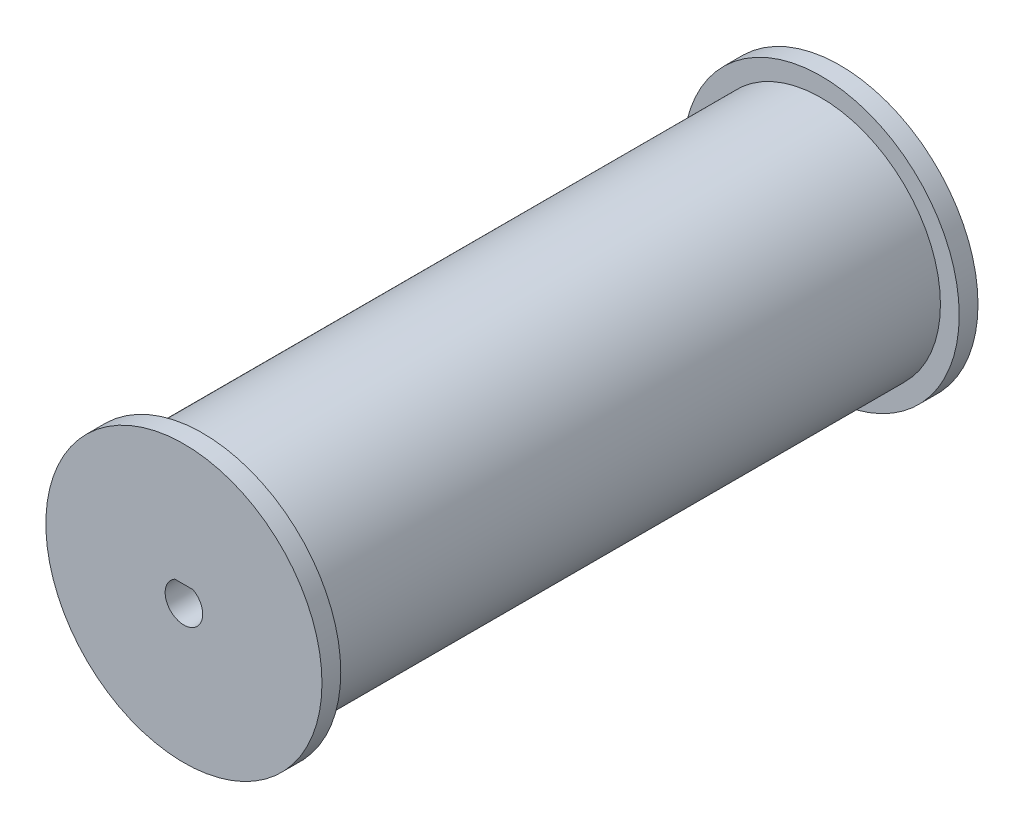
ISO-10303-21;
HEADER;
FILE_DESCRIPTION(('STEP AP214'),'2;1');
FILE_NAME('part.step','',(''),(''),'','','');
FILE_SCHEMA(('AUTOMOTIVE_DESIGN { 1 0 10303 214 1 1 1 1 }'));
ENDSEC;
DATA;
#1=APPLICATION_CONTEXT('core data for automotive mechanical design processes');
#2=APPLICATION_PROTOCOL_DEFINITION('international standard','automotive_design',2000,#1);
#3=PRODUCT_CONTEXT('',#1,'mechanical');
#4=PRODUCT('Part','Part','',(#3));
#5=PRODUCT_RELATED_PRODUCT_CATEGORY('part','',(#4));
#6=PRODUCT_DEFINITION_FORMATION('','',#4);
#7=PRODUCT_DEFINITION_CONTEXT('part definition',#1,'design');
#8=PRODUCT_DEFINITION('design','',#6,#7);
#9=PRODUCT_DEFINITION_SHAPE('','',#8);
#10=(LENGTH_UNIT() NAMED_UNIT(*) SI_UNIT(.MILLI.,.METRE.));
#11=(NAMED_UNIT(*) PLANE_ANGLE_UNIT() SI_UNIT($,.RADIAN.));
#12=(NAMED_UNIT(*) SI_UNIT($,.STERADIAN.) SOLID_ANGLE_UNIT());
#13=UNCERTAINTY_MEASURE_WITH_UNIT(LENGTH_MEASURE(1.E-05),#10,'distance_accuracy_value','');
#14=(GEOMETRIC_REPRESENTATION_CONTEXT(3) GLOBAL_UNCERTAINTY_ASSIGNED_CONTEXT((#13)) GLOBAL_UNIT_ASSIGNED_CONTEXT((#10,
#11,#12)) REPRESENTATION_CONTEXT('',''));
#15=CARTESIAN_POINT('',(0.,0.,0.));
#16=DIRECTION('',(0.,0.,1.));
#17=DIRECTION('',(1.,0.,0.));
#18=AXIS2_PLACEMENT_3D('',#15,#16,#17);
#19=CARTESIAN_POINT('',(0.,0.,69.85));
#20=DIRECTION('',(0.,0.,-1.));
#21=DIRECTION('',(-1.,0.,0.));
#22=AXIS2_PLACEMENT_3D('',#19,#20,#21);
#23=CYLINDRICAL_SURFACE('',#22,12.7);
#24=CARTESIAN_POINT('',(0.,0.,2.));
#25=DIRECTION('',(0.,0.,1.));
#26=DIRECTION('',(1.,0.,0.));
#27=AXIS2_PLACEMENT_3D('',#24,#25,#26);
#28=CIRCLE('',#27,12.7);
#29=CARTESIAN_POINT('',(12.7,0.,2.));
#30=VERTEX_POINT('',#29);
#31=EDGE_CURVE('E95',#30,#30,#28,.T.);
#32=ORIENTED_EDGE('',*,*,#31,.T.);
#33=EDGE_LOOP('',(#32));
#34=FACE_BOUND('',#33,.T.);
#35=CARTESIAN_POINT('',(0.,0.,67.85));
#36=DIRECTION('',(0.,0.,1.));
#37=DIRECTION('',(1.,0.,0.));
#38=AXIS2_PLACEMENT_3D('',#35,#36,#37);
#39=CIRCLE('',#38,12.7);
#40=CARTESIAN_POINT('',(12.7,0.,67.85));
#41=VERTEX_POINT('',#40);
#42=EDGE_CURVE('E12',#41,#41,#39,.T.);
#43=ORIENTED_EDGE('',*,*,#42,.F.);
#44=EDGE_LOOP('',(#43));
#45=FACE_BOUND('',#44,.T.);
#46=ADVANCED_FACE('F47',(#34,#45),#23,.T.);
#47=CARTESIAN_POINT('',(0.,0.,2.));
#48=DIRECTION('',(0.,0.,1.));
#49=DIRECTION('',(1.,0.,0.));
#50=AXIS2_PLACEMENT_3D('',#47,#48,#49);
#51=PLANE('',#50);
#52=CARTESIAN_POINT('',(0.,0.,2.));
#53=DIRECTION('',(0.,0.,1.));
#54=DIRECTION('',(1.,0.,0.));
#55=AXIS2_PLACEMENT_3D('',#52,#53,#54);
#56=CIRCLE('',#55,14.7);
#57=CARTESIAN_POINT('',(14.7,0.,2.));
#58=VERTEX_POINT('',#57);
#59=EDGE_CURVE('E99',#58,#58,#56,.T.);
#60=ORIENTED_EDGE('',*,*,#59,.T.);
#61=EDGE_LOOP('',(#60));
#62=FACE_BOUND('',#61,.T.);
#63=ORIENTED_EDGE('',*,*,#31,.F.);
#64=EDGE_LOOP('',(#63));
#65=FACE_BOUND('',#64,.T.);
#66=ADVANCED_FACE('F123',(#62,#65),#51,.T.);
#67=CARTESIAN_POINT('',(0.,0.,2.));
#68=DIRECTION('',(0.,0.,-1.));
#69=DIRECTION('',(-1.,0.,0.));
#70=AXIS2_PLACEMENT_3D('',#67,#68,#69);
#71=CYLINDRICAL_SURFACE('',#70,14.7);
#72=ORIENTED_EDGE('',*,*,#59,.F.);
#73=EDGE_LOOP('',(#72));
#74=FACE_BOUND('',#73,.T.);
#75=CARTESIAN_POINT('',(0.,0.,0.));
#76=DIRECTION('',(0.,0.,1.));
#77=DIRECTION('',(1.,0.,0.));
#78=AXIS2_PLACEMENT_3D('',#75,#76,#77);
#79=CIRCLE('',#78,14.7);
#80=CARTESIAN_POINT('',(14.7,0.,0.));
#81=VERTEX_POINT('',#80);
#82=EDGE_CURVE('E100',#81,#81,#79,.T.);
#83=ORIENTED_EDGE('',*,*,#82,.T.);
#84=EDGE_LOOP('',(#83));
#85=FACE_BOUND('',#84,.T.);
#86=ADVANCED_FACE('F130',(#74,#85),#71,.T.);
#87=CARTESIAN_POINT('',(0.,0.,34.925));
#88=DIRECTION('',(0.,0.,-1.));
#89=DIRECTION('',(-1.,0.,0.));
#90=AXIS2_PLACEMENT_3D('',#87,#88,#89);
#91=PLANE('',#90);
#92=CARTESIAN_POINT('',(0.,0.,34.925));
#93=DIRECTION('',(0.,0.,-1.));
#94=DIRECTION('',(-1.,0.,0.));
#95=AXIS2_PLACEMENT_3D('',#92,#93,#94);
#96=CIRCLE('',#95,2.999994);
#97=CARTESIAN_POINT('',(-2.999994,0.,34.925));
#98=VERTEX_POINT('',#97);
#99=EDGE_CURVE('E85',#98,#98,#96,.T.);
#100=ORIENTED_EDGE('',*,*,#99,.T.);
#101=EDGE_LOOP('',(#100));
#102=FACE_BOUND('',#101,.T.);
#103=ADVANCED_FACE('F139',(#102),#91,.T.);
#104=CARTESIAN_POINT('',(0.,0.,34.925));
#105=DIRECTION('',(0.,0.,-1.));
#106=DIRECTION('',(-1.,0.,0.));
#107=AXIS2_PLACEMENT_3D('',#104,#105,#106);
#108=CYLINDRICAL_SURFACE('',#107,2.999994);
#109=ORIENTED_EDGE('',*,*,#99,.F.);
#110=EDGE_LOOP('',(#109));
#111=FACE_BOUND('',#110,.T.);
#112=CARTESIAN_POINT('',(0.,0.,0.));
#113=DIRECTION('',(0.,0.,-1.));
#114=DIRECTION('',(-1.,0.,0.));
#115=AXIS2_PLACEMENT_3D('',#112,#113,#114);
#116=CIRCLE('',#115,2.999994);
#117=CARTESIAN_POINT('',(-2.999994,0.,0.));
#118=VERTEX_POINT('',#117);
#119=EDGE_CURVE('E88',#118,#118,#116,.T.);
#120=ORIENTED_EDGE('',*,*,#119,.T.);
#121=EDGE_LOOP('',(#120));
#122=FACE_BOUND('',#121,.T.);
#123=ADVANCED_FACE('F146',(#111,#122),#108,.F.);
#124=CARTESIAN_POINT('',(0.,0.,0.));
#125=DIRECTION('',(0.,0.,1.));
#126=DIRECTION('',(1.,0.,0.));
#127=AXIS2_PLACEMENT_3D('',#124,#125,#126);
#128=PLANE('',#127);
#129=ORIENTED_EDGE('',*,*,#119,.F.);
#130=EDGE_LOOP('',(#129));
#131=FACE_BOUND('',#130,.T.);
#132=ORIENTED_EDGE('',*,*,#82,.F.);
#133=EDGE_LOOP('',(#132));
#134=FACE_BOUND('',#133,.T.);
#135=ADVANCED_FACE('F118',(#131,#134),#128,.F.);
#136=CARTESIAN_POINT('',(0.,0.,67.85));
#137=DIRECTION('',(0.,0.,1.));
#138=DIRECTION('',(1.,0.,0.));
#139=AXIS2_PLACEMENT_3D('',#136,#137,#138);
#140=PLANE('',#139);
#141=CARTESIAN_POINT('',(0.,0.,67.85));
#142=DIRECTION('',(0.,0.,1.));
#143=DIRECTION('',(1.,0.,0.));
#144=AXIS2_PLACEMENT_3D('',#141,#142,#143);
#145=CIRCLE('',#144,14.7);
#146=CARTESIAN_POINT('',(14.7,0.,67.85));
#147=VERTEX_POINT('',#146);
#148=EDGE_CURVE('E103',#147,#147,#145,.T.);
#149=ORIENTED_EDGE('',*,*,#148,.F.);
#150=EDGE_LOOP('',(#149));
#151=FACE_BOUND('',#150,.T.);
#152=ORIENTED_EDGE('',*,*,#42,.T.);
#153=EDGE_LOOP('',(#152));
#154=FACE_BOUND('',#153,.T.);
#155=ADVANCED_FACE('F115',(#151,#154),#140,.F.);
#156=CARTESIAN_POINT('',(0.,0.,67.85));
#157=DIRECTION('',(0.,0.,1.));
#158=DIRECTION('',(1.,0.,0.));
#159=AXIS2_PLACEMENT_3D('',#156,#157,#158);
#160=CYLINDRICAL_SURFACE('',#159,14.7);
#161=ORIENTED_EDGE('',*,*,#148,.T.);
#162=EDGE_LOOP('',(#161));
#163=FACE_BOUND('',#162,.T.);
#164=CARTESIAN_POINT('',(0.,0.,69.85));
#165=DIRECTION('',(0.,0.,1.));
#166=DIRECTION('',(1.,0.,0.));
#167=AXIS2_PLACEMENT_3D('',#164,#165,#166);
#168=CIRCLE('',#167,14.7);
#169=CARTESIAN_POINT('',(14.7,0.,69.85));
#170=VERTEX_POINT('',#169);
#171=EDGE_CURVE('E106',#170,#170,#168,.T.);
#172=ORIENTED_EDGE('',*,*,#171,.F.);
#173=EDGE_LOOP('',(#172));
#174=FACE_BOUND('',#173,.T.);
#175=ADVANCED_FACE('F112',(#163,#174),#160,.T.);
#176=CARTESIAN_POINT('',(0.,0.,59.85));
#177=DIRECTION('',(0.,0.,1.));
#178=DIRECTION('',(1.,0.,0.));
#179=AXIS2_PLACEMENT_3D('',#176,#177,#178);
#180=PLANE('',#179);
#181=CARTESIAN_POINT('',(0.,0.,59.85));
#182=DIRECTION('',(0.,0.,1.));
#183=DIRECTION('',(1.,0.,0.));
#184=AXIS2_PLACEMENT_3D('',#181,#182,#183);
#185=CIRCLE('',#184,2.);
#186=CARTESIAN_POINT('',(-0.968245836551854,1.75,59.85));
#187=VERTEX_POINT('',#186);
#188=CARTESIAN_POINT('',(0.968245836551854,1.75,59.85));
#189=VERTEX_POINT('',#188);
#190=EDGE_CURVE('E77',#187,#189,#185,.T.);
#191=ORIENTED_EDGE('',*,*,#190,.T.);
#192=DIRECTION('',(-1.,0.,0.));
#193=VECTOR('',#192,1.);
#194=CARTESIAN_POINT('',(-0.968245836551854,1.75,59.85));
#195=LINE('',#194,#193);
#196=EDGE_CURVE('E91',#189,#187,#195,.T.);
#197=ORIENTED_EDGE('',*,*,#196,.T.);
#198=EDGE_LOOP('',(#191,#197));
#199=FACE_BOUND('',#198,.T.);
#200=ADVANCED_FACE('F151',(#199),#180,.T.);
#201=CARTESIAN_POINT('',(-0.968245836551854,1.75,59.85));
#202=DIRECTION('',(0.,1.,0.));
#203=DIRECTION('',(0.,0.,1.));
#204=AXIS2_PLACEMENT_3D('',#201,#202,#203);
#205=PLANE('',#204);
#206=DIRECTION('',(-1.,0.,0.));
#207=VECTOR('',#206,1.);
#208=CARTESIAN_POINT('',(-0.968245836551854,1.75,69.85));
#209=LINE('',#208,#207);
#210=CARTESIAN_POINT('',(0.968245836551854,1.75,69.85));
#211=VERTEX_POINT('',#210);
#212=CARTESIAN_POINT('',(-0.968245836551854,1.75,69.85));
#213=VERTEX_POINT('',#212);
#214=EDGE_CURVE('E79',#211,#213,#209,.T.);
#215=ORIENTED_EDGE('',*,*,#214,.T.);
#216=DIRECTION('',(0.,0.,1.));
#217=VECTOR('',#216,1.);
#218=CARTESIAN_POINT('',(-0.968245836551854,1.75,59.85));
#219=LINE('',#218,#217);
#220=EDGE_CURVE('E55',#187,#213,#219,.T.);
#221=ORIENTED_EDGE('',*,*,#220,.F.);
#222=ORIENTED_EDGE('',*,*,#196,.F.);
#223=DIRECTION('',(0.,0.,1.));
#224=VECTOR('',#223,1.);
#225=CARTESIAN_POINT('',(0.968245836551854,1.75,59.85));
#226=LINE('',#225,#224);
#227=EDGE_CURVE('E50',#189,#211,#226,.T.);
#228=ORIENTED_EDGE('',*,*,#227,.T.);
#229=EDGE_LOOP('',(#215,#221,#222,#228));
#230=FACE_BOUND('',#229,.T.);
#231=ADVANCED_FACE('F80',(#230),#205,.F.);
#232=CARTESIAN_POINT('',(0.,0.,59.85));
#233=DIRECTION('',(0.,0.,1.));
#234=DIRECTION('',(1.,0.,0.));
#235=AXIS2_PLACEMENT_3D('',#232,#233,#234);
#236=CYLINDRICAL_SURFACE('',#235,2.);
#237=CARTESIAN_POINT('',(0.,0.,69.85));
#238=DIRECTION('',(0.,0.,1.));
#239=DIRECTION('',(1.,0.,0.));
#240=AXIS2_PLACEMENT_3D('',#237,#238,#239);
#241=CIRCLE('',#240,2.);
#242=EDGE_CURVE('E74',#213,#211,#241,.T.);
#243=ORIENTED_EDGE('',*,*,#242,.T.);
#244=ORIENTED_EDGE('',*,*,#227,.F.);
#245=ORIENTED_EDGE('',*,*,#190,.F.);
#246=ORIENTED_EDGE('',*,*,#220,.T.);
#247=EDGE_LOOP('',(#243,#244,#245,#246));
#248=FACE_BOUND('',#247,.T.);
#249=ADVANCED_FACE('F72',(#248),#236,.F.);
#250=CARTESIAN_POINT('',(0.,0.,69.85));
#251=DIRECTION('',(0.,0.,1.));
#252=DIRECTION('',(1.,0.,0.));
#253=AXIS2_PLACEMENT_3D('',#250,#251,#252);
#254=PLANE('',#253);
#255=ORIENTED_EDGE('',*,*,#242,.F.);
#256=ORIENTED_EDGE('',*,*,#214,.F.);
#257=EDGE_LOOP('',(#255,#256));
#258=FACE_BOUND('',#257,.T.);
#259=ORIENTED_EDGE('',*,*,#171,.T.);
#260=EDGE_LOOP('',(#259));
#261=FACE_BOUND('',#260,.T.);
#262=ADVANCED_FACE('F83',(#258,#261),#254,.T.);
#263=CLOSED_SHELL('',(#46,#66,#86,#103,#123,#135,#155,#175,#200,#231,#249,#262));
#264=MANIFOLD_SOLID_BREP('B2',#263);
#265=ADVANCED_BREP_SHAPE_REPRESENTATION('',(#18,#264),#14);
#266=SHAPE_DEFINITION_REPRESENTATION(#9,#265);
ENDSEC;
END-ISO-10303-21;
